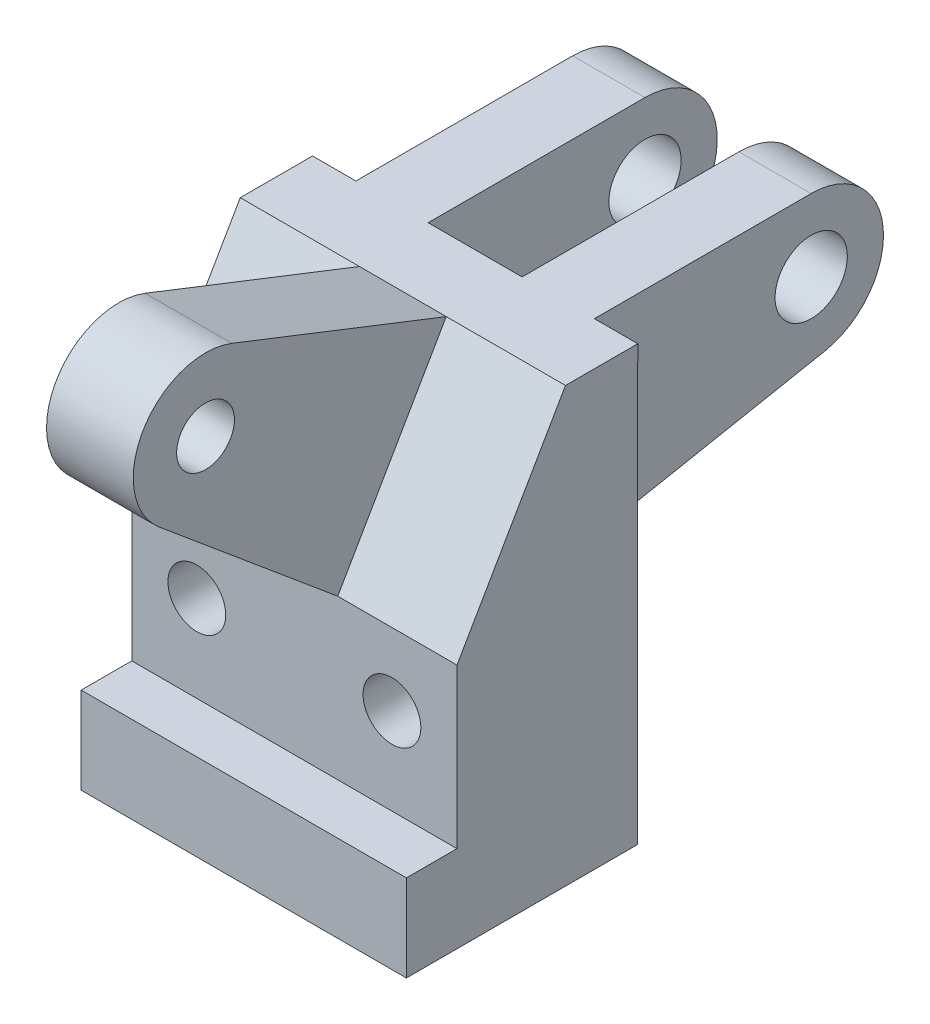
ISO-10303-21;
HEADER;
FILE_DESCRIPTION(('STEP AP214'),'2;1');
FILE_NAME('part.step','',(''),(''),'','','');
FILE_SCHEMA(('AUTOMOTIVE_DESIGN { 1 0 10303 214 1 1 1 1 }'));
ENDSEC;
DATA;
#1=APPLICATION_CONTEXT('core data for automotive mechanical design processes');
#2=APPLICATION_PROTOCOL_DEFINITION('international standard','automotive_design',2000,#1);
#3=PRODUCT_CONTEXT('',#1,'mechanical');
#4=PRODUCT('Part','Part','',(#3));
#5=PRODUCT_RELATED_PRODUCT_CATEGORY('part','',(#4));
#6=PRODUCT_DEFINITION_FORMATION('','',#4);
#7=PRODUCT_DEFINITION_CONTEXT('part definition',#1,'design');
#8=PRODUCT_DEFINITION('design','',#6,#7);
#9=PRODUCT_DEFINITION_SHAPE('','',#8);
#10=(LENGTH_UNIT() NAMED_UNIT(*) SI_UNIT(.MILLI.,.METRE.));
#11=(NAMED_UNIT(*) PLANE_ANGLE_UNIT() SI_UNIT($,.RADIAN.));
#12=(NAMED_UNIT(*) SI_UNIT($,.STERADIAN.) SOLID_ANGLE_UNIT());
#13=UNCERTAINTY_MEASURE_WITH_UNIT(LENGTH_MEASURE(1.E-05),#10,'distance_accuracy_value','');
#14=(GEOMETRIC_REPRESENTATION_CONTEXT(3) GLOBAL_UNCERTAINTY_ASSIGNED_CONTEXT((#13)) GLOBAL_UNIT_ASSIGNED_CONTEXT((#10,
#11,#12)) REPRESENTATION_CONTEXT('',''));
#15=CARTESIAN_POINT('',(0.,0.,0.));
#16=DIRECTION('',(0.,0.,1.));
#17=DIRECTION('',(1.,0.,0.));
#18=AXIS2_PLACEMENT_3D('',#15,#16,#17);
#19=CARTESIAN_POINT('',(22.5,34.0192378864669,9.00000000000001));
#20=DIRECTION('',(0.,-0.500000000000001,-0.866025403784438));
#21=DIRECTION('',(0.,0.866025403784438,-0.500000000000001));
#22=AXIS2_PLACEMENT_3D('',#19,#20,#21);
#23=PLANE('',#22);
#24=DIRECTION('',(0.,0.866025403784438,-0.500000000000001));
#25=VECTOR('',#24,1.);
#26=CARTESIAN_POINT('',(6.,60.0192378864669,-6.01110699893029));
#27=LINE('',#26,#25);
#28=CARTESIAN_POINT('',(6.00000000000001,34.0192378864669,9.00000000000001));
#29=VERTEX_POINT('',#28);
#30=CARTESIAN_POINT('',(6.,60.0192378864669,-6.01110699893029));
#31=VERTEX_POINT('',#30);
#32=EDGE_CURVE('E188',#29,#31,#27,.T.);
#33=ORIENTED_EDGE('',*,*,#32,.F.);
#34=DIRECTION('',(-1.,0.,0.));
#35=VECTOR('',#34,1.);
#36=CARTESIAN_POINT('',(22.5,34.0192378864669,9.00000000000001));
#37=LINE('',#36,#35);
#38=CARTESIAN_POINT('',(22.5,34.0192378864669,9.00000000000001));
#39=VERTEX_POINT('',#38);
#40=EDGE_CURVE('E352',#39,#29,#37,.T.);
#41=ORIENTED_EDGE('',*,*,#40,.F.);
#42=DIRECTION('',(0.,-0.866025403784438,0.500000000000001));
#43=VECTOR('',#42,1.);
#44=CARTESIAN_POINT('',(22.5,34.0192378864669,9.00000000000001));
#45=LINE('',#44,#43);
#46=CARTESIAN_POINT('',(22.5,60.0192378864669,-6.01110699893029));
#47=VERTEX_POINT('',#46);
#48=EDGE_CURVE('E313',#47,#39,#45,.T.);
#49=ORIENTED_EDGE('',*,*,#48,.F.);
#50=DIRECTION('',(-1.,0.,0.));
#51=VECTOR('',#50,1.);
#52=CARTESIAN_POINT('',(22.5,60.0192378864669,-6.01110699893029));
#53=LINE('',#52,#51);
#54=EDGE_CURVE('E357',#47,#31,#53,.T.);
#55=ORIENTED_EDGE('',*,*,#54,.T.);
#56=EDGE_LOOP('',(#33,#41,#49,#55));
#57=FACE_BOUND('',#56,.T.);
#58=ADVANCED_FACE('F38',(#57),#23,.F.);
#59=CARTESIAN_POINT('',(22.5,60.0192378864669,-16.0111069989303));
#60=DIRECTION('',(0.,0.000185116645666411,0.999999982865914));
#61=DIRECTION('',(0.,-0.999999982865914,0.000185116645666411));
#62=AXIS2_PLACEMENT_3D('',#59,#60,#61);
#63=PLANE('',#62);
#64=CARTESIAN_POINT('',(-13.5,24.0192378864669,-16.0044427995721));
#65=DIRECTION('',(0.,0.000185116645666411,0.999999982865914));
#66=DIRECTION('',(0.,-0.999999982865914,0.000185116645666411));
#67=AXIS2_PLACEMENT_3D('',#64,#65,#66);
#68=ELLIPSE('',#67,4.00000006853635,4.);
#69=CARTESIAN_POINT('',(-13.5,20.0192378864669,-16.0037023329768));
#70=VERTEX_POINT('',#69);
#71=EDGE_CURVE('E477',#70,#70,#68,.T.);
#72=ORIENTED_EDGE('',*,*,#71,.T.);
#73=EDGE_LOOP('',(#72));
#74=FACE_BOUND('',#73,.T.);
#75=CARTESIAN_POINT('',(13.5,24.0192378864669,-16.0044427995721));
#76=DIRECTION('',(0.,0.000185116645666411,0.999999982865914));
#77=DIRECTION('',(0.,-0.999999982865914,0.000185116645666411));
#78=AXIS2_PLACEMENT_3D('',#75,#76,#77);
#79=ELLIPSE('',#78,4.00000006853635,4.);
#80=CARTESIAN_POINT('',(13.5,20.0192378864669,-16.0037023329768));
#81=VERTEX_POINT('',#80);
#82=EDGE_CURVE('E484',#81,#81,#79,.T.);
#83=ORIENTED_EDGE('',*,*,#82,.T.);
#84=EDGE_LOOP('',(#83));
#85=FACE_BOUND('',#84,.T.);
#86=DIRECTION('',(0.,-0.999999982865914,0.000185116645666452));
#87=VECTOR('',#86,1.);
#88=CARTESIAN_POINT('',(-16.5,34.0192383319532,-16.006293966143));
#89=LINE('',#88,#87);
#90=CARTESIAN_POINT('',(-16.5,60.0192378864669,-16.0111069989303));
#91=VERTEX_POINT('',#90);
#92=CARTESIAN_POINT('',(-16.5,34.0192383319532,-16.006293966143));
#93=VERTEX_POINT('',#92);
#94=EDGE_CURVE('E215',#91,#93,#89,.T.);
#95=ORIENTED_EDGE('',*,*,#94,.T.);
#96=DIRECTION('',(1.,0.,0.));
#97=VECTOR('',#96,1.);
#98=CARTESIAN_POINT('',(-16.5,34.0192383319532,-16.006293966143));
#99=LINE('',#98,#97);
#100=CARTESIAN_POINT('',(-6.5,34.0192383319532,-16.006293966143));
#101=VERTEX_POINT('',#100);
#102=EDGE_CURVE('E228',#93,#101,#99,.T.);
#103=ORIENTED_EDGE('',*,*,#102,.T.);
#104=DIRECTION('',(0.,-0.999999982865914,0.000185116645666452));
#105=VECTOR('',#104,1.);
#106=CARTESIAN_POINT('',(-6.5,34.0192383319532,-16.006293966143));
#107=LINE('',#106,#105);
#108=CARTESIAN_POINT('',(-6.5,60.0192378864669,-16.0111069989303));
#109=VERTEX_POINT('',#108);
#110=EDGE_CURVE('E231',#109,#101,#107,.T.);
#111=ORIENTED_EDGE('',*,*,#110,.F.);
#112=DIRECTION('',(-1.,0.,0.));
#113=VECTOR('',#112,1.);
#114=CARTESIAN_POINT('',(22.5,60.0192378864669,-16.0111069989303));
#115=LINE('',#114,#113);
#116=CARTESIAN_POINT('',(6.50000000000001,60.0192378864669,-16.0111069989303));
#117=VERTEX_POINT('',#116);
#118=EDGE_CURVE('E364',#117,#109,#115,.T.);
#119=ORIENTED_EDGE('',*,*,#118,.F.);
#120=DIRECTION('',(0.,-0.999999982865914,0.000185116645666452));
#121=VECTOR('',#120,1.);
#122=CARTESIAN_POINT('',(6.5,34.0192383319532,-16.006293966143));
#123=LINE('',#122,#121);
#124=CARTESIAN_POINT('',(6.5,34.0192383319532,-16.006293966143));
#125=VERTEX_POINT('',#124);
#126=EDGE_CURVE('E279',#117,#125,#123,.T.);
#127=ORIENTED_EDGE('',*,*,#126,.T.);
#128=DIRECTION('',(-1.,0.,0.));
#129=VECTOR('',#128,1.);
#130=CARTESIAN_POINT('',(16.5,34.0192383319532,-16.006293966143));
#131=LINE('',#130,#129);
#132=CARTESIAN_POINT('',(16.5,34.0192383319532,-16.006293966143));
#133=VERTEX_POINT('',#132);
#134=EDGE_CURVE('E294',#133,#125,#131,.T.);
#135=ORIENTED_EDGE('',*,*,#134,.F.);
#136=DIRECTION('',(0.,-0.999999982865914,0.000185116645666452));
#137=VECTOR('',#136,1.);
#138=CARTESIAN_POINT('',(16.5,34.0192383319532,-16.006293966143));
#139=LINE('',#138,#137);
#140=CARTESIAN_POINT('',(16.5,60.0192378864669,-16.0111069989303));
#141=VERTEX_POINT('',#140);
#142=EDGE_CURVE('E264',#141,#133,#139,.T.);
#143=ORIENTED_EDGE('',*,*,#142,.F.);
#144=CARTESIAN_POINT('',(22.5,60.0192378864669,-16.0111069989303));
#145=VERTEX_POINT('',#144);
#146=EDGE_CURVE('E361',#145,#141,#115,.T.);
#147=ORIENTED_EDGE('',*,*,#146,.F.);
#148=DIRECTION('',(0.,0.999999982865913,-0.000185116645666411));
#149=VECTOR('',#148,1.);
#150=CARTESIAN_POINT('',(22.5,60.0192378864669,-16.0111069989303));
#151=LINE('',#150,#149);
#152=CARTESIAN_POINT('',(22.5,0.0192378864669156,-16.));
#153=VERTEX_POINT('',#152);
#154=EDGE_CURVE('E307',#153,#145,#151,.T.);
#155=ORIENTED_EDGE('',*,*,#154,.F.);
#156=DIRECTION('',(-1.,0.,0.));
#157=VECTOR('',#156,1.);
#158=CARTESIAN_POINT('',(22.5,0.0192378864669156,-16.));
#159=LINE('',#158,#157);
#160=CARTESIAN_POINT('',(-22.5,0.0192378864669156,-16.));
#161=VERTEX_POINT('',#160);
#162=EDGE_CURVE('E47',#153,#161,#159,.T.);
#163=ORIENTED_EDGE('',*,*,#162,.T.);
#164=DIRECTION('',(0.,0.999999982865913,-0.000185116645666411));
#165=VECTOR('',#164,1.);
#166=CARTESIAN_POINT('',(-22.5,60.0192378864669,-16.0111069989303));
#167=LINE('',#166,#165);
#168=CARTESIAN_POINT('',(-22.5,60.0192378864669,-16.0111069989303));
#169=VERTEX_POINT('',#168);
#170=EDGE_CURVE('E329',#161,#169,#167,.T.);
#171=ORIENTED_EDGE('',*,*,#170,.T.);
#172=EDGE_CURVE('E360',#91,#169,#115,.T.);
#173=ORIENTED_EDGE('',*,*,#172,.F.);
#174=EDGE_LOOP('',(#95,#103,#111,#119,#127,#135,#143,#147,#155,#163,#171,#173));
#175=FACE_BOUND('',#174,.T.);
#176=ADVANCED_FACE('F371',(#74,#85,#175),#63,.F.);
#177=CARTESIAN_POINT('',(22.5,0.019237886466919,16.));
#178=DIRECTION('',(0.,0.,-1.));
#179=DIRECTION('',(0.,1.,0.));
#180=AXIS2_PLACEMENT_3D('',#177,#178,#179);
#181=PLANE('',#180);
#182=DIRECTION('',(0.,-1.,0.));
#183=VECTOR('',#182,1.);
#184=CARTESIAN_POINT('',(-22.5,0.019237886466919,16.));
#185=LINE('',#184,#183);
#186=CARTESIAN_POINT('',(-22.5,12.0192378864669,16.));
#187=VERTEX_POINT('',#186);
#188=CARTESIAN_POINT('',(-22.5,0.019237886466919,16.));
#189=VERTEX_POINT('',#188);
#190=EDGE_CURVE('E298',#187,#189,#185,.T.);
#191=ORIENTED_EDGE('',*,*,#190,.T.);
#192=DIRECTION('',(-1.,0.,0.));
#193=VECTOR('',#192,1.);
#194=CARTESIAN_POINT('',(22.5,0.019237886466919,16.));
#195=LINE('',#194,#193);
#196=CARTESIAN_POINT('',(22.5,0.019237886466919,16.));
#197=VERTEX_POINT('',#196);
#198=EDGE_CURVE('E11',#197,#189,#195,.T.);
#199=ORIENTED_EDGE('',*,*,#198,.F.);
#200=DIRECTION('',(0.,-1.,0.));
#201=VECTOR('',#200,1.);
#202=CARTESIAN_POINT('',(22.5,0.019237886466919,16.));
#203=LINE('',#202,#201);
#204=CARTESIAN_POINT('',(22.5,12.0192378864669,16.));
#205=VERTEX_POINT('',#204);
#206=EDGE_CURVE('E299',#205,#197,#203,.T.);
#207=ORIENTED_EDGE('',*,*,#206,.F.);
#208=DIRECTION('',(-1.,0.,0.));
#209=VECTOR('',#208,1.);
#210=CARTESIAN_POINT('',(22.5,12.0192378864669,16.));
#211=LINE('',#210,#209);
#212=EDGE_CURVE('E322',#205,#187,#211,.T.);
#213=ORIENTED_EDGE('',*,*,#212,.T.);
#214=EDGE_LOOP('',(#191,#199,#207,#213));
#215=FACE_BOUND('',#214,.T.);
#216=ADVANCED_FACE('F40',(#215),#181,.F.);
#217=CARTESIAN_POINT('',(22.5,0.019237886466919,16.));
#218=DIRECTION('',(0.,1.,0.));
#219=DIRECTION('',(0.,0.,1.));
#220=AXIS2_PLACEMENT_3D('',#217,#218,#219);
#221=PLANE('',#220);
#222=DIRECTION('',(0.,0.,-1.));
#223=VECTOR('',#222,1.);
#224=CARTESIAN_POINT('',(-22.5,0.019237886466919,16.));
#225=LINE('',#224,#223);
#226=EDGE_CURVE('E326',#189,#161,#225,.T.);
#227=ORIENTED_EDGE('',*,*,#226,.T.);
#228=ORIENTED_EDGE('',*,*,#162,.F.);
#229=DIRECTION('',(0.,0.,-1.));
#230=VECTOR('',#229,1.);
#231=CARTESIAN_POINT('',(22.5,0.019237886466919,16.));
#232=LINE('',#231,#230);
#233=EDGE_CURVE('E303',#197,#153,#232,.T.);
#234=ORIENTED_EDGE('',*,*,#233,.F.);
#235=ORIENTED_EDGE('',*,*,#198,.T.);
#236=EDGE_LOOP('',(#227,#228,#234,#235));
#237=FACE_BOUND('',#236,.T.);
#238=ADVANCED_FACE('F418',(#237),#221,.F.);
#239=CARTESIAN_POINT('',(22.5,60.0192378864669,-6.01110699893029));
#240=DIRECTION('',(0.,-1.,0.));
#241=DIRECTION('',(0.,0.,-1.));
#242=AXIS2_PLACEMENT_3D('',#239,#240,#241);
#243=PLANE('',#242);
#244=DIRECTION('',(0.,0.,1.));
#245=VECTOR('',#244,1.);
#246=CARTESIAN_POINT('',(-22.5,60.0192378864669,-6.01110699893029));
#247=LINE('',#246,#245);
#248=CARTESIAN_POINT('',(-22.5,60.0192378864669,-6.01110699893029));
#249=VERTEX_POINT('',#248);
#250=EDGE_CURVE('E333',#169,#249,#247,.T.);
#251=ORIENTED_EDGE('',*,*,#250,.T.);
#252=CARTESIAN_POINT('',(-5.99999999999999,60.0192378864669,-6.01110699893029));
#253=VERTEX_POINT('',#252);
#254=EDGE_CURVE('E356',#253,#249,#53,.T.);
#255=ORIENTED_EDGE('',*,*,#254,.F.);
#256=DIRECTION('',(-1.,0.,0.));
#257=VECTOR('',#256,1.);
#258=CARTESIAN_POINT('',(6.,60.0192378864669,-6.01110699893029));
#259=LINE('',#258,#257);
#260=EDGE_CURVE('E451',#31,#253,#259,.T.);
#261=ORIENTED_EDGE('',*,*,#260,.F.);
#262=ORIENTED_EDGE('',*,*,#54,.F.);
#263=DIRECTION('',(0.,0.,1.));
#264=VECTOR('',#263,1.);
#265=CARTESIAN_POINT('',(22.5,60.0192378864669,-6.01110699893029));
#266=LINE('',#265,#264);
#267=EDGE_CURVE('E310',#145,#47,#266,.T.);
#268=ORIENTED_EDGE('',*,*,#267,.F.);
#269=ORIENTED_EDGE('',*,*,#146,.T.);
#270=DIRECTION('',(0.,0.,1.));
#271=VECTOR('',#270,1.);
#272=CARTESIAN_POINT('',(16.5,60.0192378864669,-16.0111069989303));
#273=LINE('',#272,#271);
#274=CARTESIAN_POINT('',(16.5,60.0192378864669,-46.0111069989303));
#275=VERTEX_POINT('',#274);
#276=EDGE_CURVE('E260',#275,#141,#273,.T.);
#277=ORIENTED_EDGE('',*,*,#276,.F.);
#278=DIRECTION('',(-1.,0.,0.));
#279=VECTOR('',#278,1.);
#280=CARTESIAN_POINT('',(16.5,60.0192378864669,-46.0111069989303));
#281=LINE('',#280,#279);
#282=CARTESIAN_POINT('',(6.5,60.0192378864669,-46.0111069989303));
#283=VERTEX_POINT('',#282);
#284=EDGE_CURVE('E275',#275,#283,#281,.T.);
#285=ORIENTED_EDGE('',*,*,#284,.T.);
#286=DIRECTION('',(0.,0.,1.));
#287=VECTOR('',#286,1.);
#288=CARTESIAN_POINT('',(6.5,60.0192378864669,-16.0111069989303));
#289=LINE('',#288,#287);
#290=EDGE_CURVE('E256',#283,#117,#289,.T.);
#291=ORIENTED_EDGE('',*,*,#290,.T.);
#292=ORIENTED_EDGE('',*,*,#118,.T.);
#293=DIRECTION('',(0.,0.,1.));
#294=VECTOR('',#293,1.);
#295=CARTESIAN_POINT('',(-6.5,60.0192378864669,-16.0111069989303));
#296=LINE('',#295,#294);
#297=CARTESIAN_POINT('',(-6.5,60.0192378864669,-46.0111069989303));
#298=VERTEX_POINT('',#297);
#299=EDGE_CURVE('E210',#298,#109,#296,.T.);
#300=ORIENTED_EDGE('',*,*,#299,.F.);
#301=DIRECTION('',(1.,0.,0.));
#302=VECTOR('',#301,1.);
#303=CARTESIAN_POINT('',(-16.5,60.0192378864669,-46.0111069989303));
#304=LINE('',#303,#302);
#305=CARTESIAN_POINT('',(-16.5,60.0192378864669,-46.0111069989303));
#306=VERTEX_POINT('',#305);
#307=EDGE_CURVE('E242',#306,#298,#304,.T.);
#308=ORIENTED_EDGE('',*,*,#307,.F.);
#309=DIRECTION('',(0.,0.,1.));
#310=VECTOR('',#309,1.);
#311=CARTESIAN_POINT('',(-16.5,60.0192378864669,-16.0111069989303));
#312=LINE('',#311,#310);
#313=EDGE_CURVE('E212',#306,#91,#312,.T.);
#314=ORIENTED_EDGE('',*,*,#313,.T.);
#315=ORIENTED_EDGE('',*,*,#172,.T.);
#316=EDGE_LOOP('',(#251,#255,#261,#262,#268,#269,#277,#285,#291,#292,#300,#308,#314,#315));
#317=FACE_BOUND('',#316,.T.);
#318=ADVANCED_FACE('F382',(#317),#243,.F.);
#319=CARTESIAN_POINT('',(-5.99999999999999,34.0192378864669,9.00000000000001));
#320=VERTEX_POINT('',#319);
#321=CARTESIAN_POINT('',(-22.5,34.0192378864669,9.00000000000001));
#322=VERTEX_POINT('',#321);
#323=EDGE_CURVE('E59',#320,#322,#37,.T.);
#324=ORIENTED_EDGE('',*,*,#323,.F.);
#325=DIRECTION('',(0.,0.866025403784438,-0.500000000000001));
#326=VECTOR('',#325,1.);
#327=CARTESIAN_POINT('',(-6.,60.0192378864669,-6.01110699893029));
#328=LINE('',#327,#326);
#329=EDGE_CURVE('E54',#320,#253,#328,.T.);
#330=ORIENTED_EDGE('',*,*,#329,.T.);
#331=ORIENTED_EDGE('',*,*,#254,.T.);
#332=DIRECTION('',(0.,-0.866025403784438,0.500000000000001));
#333=VECTOR('',#332,1.);
#334=CARTESIAN_POINT('',(-22.5,34.0192378864669,9.00000000000001));
#335=LINE('',#334,#333);
#336=EDGE_CURVE('E337',#249,#322,#335,.T.);
#337=ORIENTED_EDGE('',*,*,#336,.T.);
#338=EDGE_LOOP('',(#324,#330,#331,#337));
#339=FACE_BOUND('',#338,.T.);
#340=ADVANCED_FACE('F432',(#339),#23,.F.);
#341=CARTESIAN_POINT('',(22.5,12.0192378864669,9.00000000000001));
#342=DIRECTION('',(0.,0.,-1.));
#343=DIRECTION('',(-1.,0.,0.));
#344=AXIS2_PLACEMENT_3D('',#341,#342,#343);
#345=PLANE('',#344);
#346=CARTESIAN_POINT('',(-13.5,24.0192378864669,9.00000000000001));
#347=DIRECTION('',(0.,0.,1.));
#348=DIRECTION('',(1.,0.,0.));
#349=AXIS2_PLACEMENT_3D('',#346,#347,#348);
#350=CIRCLE('',#349,4.);
#351=CARTESIAN_POINT('',(-9.5,24.0192378864669,9.00000000000001));
#352=VERTEX_POINT('',#351);
#353=EDGE_CURVE('E488',#352,#352,#350,.T.);
#354=ORIENTED_EDGE('',*,*,#353,.F.);
#355=EDGE_LOOP('',(#354));
#356=FACE_BOUND('',#355,.T.);
#357=CARTESIAN_POINT('',(13.5,24.0192378864669,9.00000000000001));
#358=DIRECTION('',(0.,0.,1.));
#359=DIRECTION('',(1.,0.,0.));
#360=AXIS2_PLACEMENT_3D('',#357,#358,#359);
#361=CIRCLE('',#360,4.);
#362=CARTESIAN_POINT('',(17.5,24.0192378864669,9.00000000000001));
#363=VERTEX_POINT('',#362);
#364=EDGE_CURVE('E489',#363,#363,#361,.T.);
#365=ORIENTED_EDGE('',*,*,#364,.F.);
#366=EDGE_LOOP('',(#365));
#367=FACE_BOUND('',#366,.T.);
#368=DIRECTION('',(0.,-1.,0.));
#369=VECTOR('',#368,1.);
#370=CARTESIAN_POINT('',(-22.5,12.0192378864669,9.00000000000001));
#371=LINE('',#370,#369);
#372=CARTESIAN_POINT('',(-22.5,12.0192378864669,9.00000000000001));
#373=VERTEX_POINT('',#372);
#374=EDGE_CURVE('E340',#322,#373,#371,.T.);
#375=ORIENTED_EDGE('',*,*,#374,.T.);
#376=DIRECTION('',(-1.,0.,0.));
#377=VECTOR('',#376,1.);
#378=CARTESIAN_POINT('',(22.5,12.0192378864669,9.00000000000001));
#379=LINE('',#378,#377);
#380=CARTESIAN_POINT('',(22.5,12.0192378864669,9.00000000000001));
#381=VERTEX_POINT('',#380);
#382=EDGE_CURVE('E348',#381,#373,#379,.T.);
#383=ORIENTED_EDGE('',*,*,#382,.F.);
#384=DIRECTION('',(0.,-1.,0.));
#385=VECTOR('',#384,1.);
#386=CARTESIAN_POINT('',(22.5,12.0192378864669,9.00000000000001));
#387=LINE('',#386,#385);
#388=EDGE_CURVE('E316',#39,#381,#387,.T.);
#389=ORIENTED_EDGE('',*,*,#388,.F.);
#390=ORIENTED_EDGE('',*,*,#40,.T.);
#391=DIRECTION('',(-1.,0.,0.));
#392=VECTOR('',#391,1.);
#393=CARTESIAN_POINT('',(6.,34.0192378864669,9.00000000000001));
#394=LINE('',#393,#392);
#395=EDGE_CURVE('E204',#29,#320,#394,.T.);
#396=ORIENTED_EDGE('',*,*,#395,.T.);
#397=ORIENTED_EDGE('',*,*,#323,.T.);
#398=EDGE_LOOP('',(#375,#383,#389,#390,#396,#397));
#399=FACE_BOUND('',#398,.T.);
#400=ADVANCED_FACE('F428',(#356,#367,#399),#345,.F.);
#401=CARTESIAN_POINT('',(22.5,12.0192378864669,16.));
#402=DIRECTION('',(0.,-1.,0.));
#403=DIRECTION('',(0.,0.,-1.));
#404=AXIS2_PLACEMENT_3D('',#401,#402,#403);
#405=PLANE('',#404);
#406=DIRECTION('',(0.,0.,1.));
#407=VECTOR('',#406,1.);
#408=CARTESIAN_POINT('',(-22.5,12.0192378864669,16.));
#409=LINE('',#408,#407);
#410=EDGE_CURVE('E304',#373,#187,#409,.T.);
#411=ORIENTED_EDGE('',*,*,#410,.T.);
#412=ORIENTED_EDGE('',*,*,#212,.F.);
#413=DIRECTION('',(0.,0.,1.));
#414=VECTOR('',#413,1.);
#415=CARTESIAN_POINT('',(22.5,12.0192378864669,16.));
#416=LINE('',#415,#414);
#417=EDGE_CURVE('E319',#381,#205,#416,.T.);
#418=ORIENTED_EDGE('',*,*,#417,.F.);
#419=ORIENTED_EDGE('',*,*,#382,.T.);
#420=EDGE_LOOP('',(#411,#412,#418,#419));
#421=FACE_BOUND('',#420,.T.);
#422=ADVANCED_FACE('F423',(#421),#405,.F.);
#423=CARTESIAN_POINT('',(22.5,0.,0.));
#424=DIRECTION('',(-1.,0.,0.));
#425=DIRECTION('',(0.,0.,1.));
#426=AXIS2_PLACEMENT_3D('',#423,#424,#425);
#427=PLANE('',#426);
#428=ORIENTED_EDGE('',*,*,#206,.T.);
#429=ORIENTED_EDGE('',*,*,#233,.T.);
#430=ORIENTED_EDGE('',*,*,#154,.T.);
#431=ORIENTED_EDGE('',*,*,#267,.T.);
#432=ORIENTED_EDGE('',*,*,#48,.T.);
#433=ORIENTED_EDGE('',*,*,#388,.T.);
#434=ORIENTED_EDGE('',*,*,#417,.T.);
#435=EDGE_LOOP('',(#428,#429,#430,#431,#432,#433,#434));
#436=FACE_BOUND('',#435,.T.);
#437=ADVANCED_FACE('F414',(#436),#427,.F.);
#438=CARTESIAN_POINT('',(-22.5,0.,0.));
#439=DIRECTION('',(-1.,0.,0.));
#440=DIRECTION('',(0.,0.,1.));
#441=AXIS2_PLACEMENT_3D('',#438,#439,#440);
#442=PLANE('',#441);
#443=ORIENTED_EDGE('',*,*,#190,.F.);
#444=ORIENTED_EDGE('',*,*,#410,.F.);
#445=ORIENTED_EDGE('',*,*,#374,.F.);
#446=ORIENTED_EDGE('',*,*,#336,.F.);
#447=ORIENTED_EDGE('',*,*,#250,.F.);
#448=ORIENTED_EDGE('',*,*,#170,.F.);
#449=ORIENTED_EDGE('',*,*,#226,.F.);
#450=EDGE_LOOP('',(#443,#444,#445,#446,#447,#448,#449));
#451=FACE_BOUND('',#450,.T.);
#452=ADVANCED_FACE('F378',(#451),#442,.T.);
#453=CARTESIAN_POINT('',(16.5,50.0192378864669,-46.0111069989303));
#454=DIRECTION('',(1.,0.,0.));
#455=DIRECTION('',(0.,0.,-1.));
#456=AXIS2_PLACEMENT_3D('',#453,#454,#455);
#457=PLANE('',#456);
#458=ORIENTED_EDGE('',*,*,#276,.T.);
#459=ORIENTED_EDGE('',*,*,#142,.T.);
#460=DIRECTION('',(0.,0.190230507607556,-0.981739453203023));
#461=VECTOR('',#460,1.);
#462=CARTESIAN_POINT('',(16.5,40.2018433544367,-47.9134120750059));
#463=LINE('',#462,#461);
#464=CARTESIAN_POINT('',(16.5,40.2018433544367,-47.9134120750059));
#465=VERTEX_POINT('',#464);
#466=EDGE_CURVE('E269',#133,#465,#463,.T.);
#467=ORIENTED_EDGE('',*,*,#466,.T.);
#468=CARTESIAN_POINT('',(16.5,50.0192378864669,-46.0111069989303));
#469=DIRECTION('',(1.,0.,0.));
#470=DIRECTION('',(0.,0.,-1.));
#471=AXIS2_PLACEMENT_3D('',#468,#469,#470);
#472=CIRCLE('',#471,10.);
#473=EDGE_CURVE('E272',#465,#275,#472,.T.);
#474=ORIENTED_EDGE('',*,*,#473,.T.);
#475=EDGE_LOOP('',(#458,#459,#467,#474));
#476=FACE_BOUND('',#475,.T.);
#477=CARTESIAN_POINT('',(16.5,50.0192378864669,-46.0111069989303));
#478=DIRECTION('',(1.,0.,0.));
#479=DIRECTION('',(0.,0.,-1.));
#480=AXIS2_PLACEMENT_3D('',#477,#478,#479);
#481=CIRCLE('',#480,5.);
#482=CARTESIAN_POINT('',(16.5,50.0192378864669,-51.0111069989303));
#483=VERTEX_POINT('',#482);
#484=EDGE_CURVE('E252',#483,#483,#481,.T.);
#485=ORIENTED_EDGE('',*,*,#484,.F.);
#486=EDGE_LOOP('',(#485));
#487=FACE_BOUND('',#486,.T.);
#488=ADVANCED_FACE('F408',(#476,#487),#457,.T.);
#489=CARTESIAN_POINT('',(6.5,50.0192378864669,-46.0111069989303));
#490=DIRECTION('',(1.,0.,0.));
#491=DIRECTION('',(0.,0.,-1.));
#492=AXIS2_PLACEMENT_3D('',#489,#490,#491);
#493=PLANE('',#492);
#494=ORIENTED_EDGE('',*,*,#290,.F.);
#495=CARTESIAN_POINT('',(6.5,50.0192378864669,-46.0111069989303));
#496=DIRECTION('',(1.,0.,0.));
#497=DIRECTION('',(0.,0.,-1.));
#498=AXIS2_PLACEMENT_3D('',#495,#496,#497);
#499=CIRCLE('',#498,10.);
#500=CARTESIAN_POINT('',(6.5,40.2018433544367,-47.9134120750059));
#501=VERTEX_POINT('',#500);
#502=EDGE_CURVE('E265',#501,#283,#499,.T.);
#503=ORIENTED_EDGE('',*,*,#502,.F.);
#504=DIRECTION('',(0.,0.190230507607556,-0.981739453203023));
#505=VECTOR('',#504,1.);
#506=CARTESIAN_POINT('',(6.5,40.2018433544367,-47.9134120750059));
#507=LINE('',#506,#505);
#508=EDGE_CURVE('E282',#125,#501,#507,.T.);
#509=ORIENTED_EDGE('',*,*,#508,.F.);
#510=ORIENTED_EDGE('',*,*,#126,.F.);
#511=EDGE_LOOP('',(#494,#503,#509,#510));
#512=FACE_BOUND('',#511,.T.);
#513=CARTESIAN_POINT('',(6.5,50.0192378864669,-46.0111069989303));
#514=DIRECTION('',(1.,0.,0.));
#515=DIRECTION('',(0.,0.,-1.));
#516=AXIS2_PLACEMENT_3D('',#513,#514,#515);
#517=CIRCLE('',#516,5.);
#518=CARTESIAN_POINT('',(6.5,50.0192378864669,-51.0111069989303));
#519=VERTEX_POINT('',#518);
#520=EDGE_CURVE('E245',#519,#519,#517,.T.);
#521=ORIENTED_EDGE('',*,*,#520,.T.);
#522=EDGE_LOOP('',(#521));
#523=FACE_BOUND('',#522,.T.);
#524=ADVANCED_FACE('F395',(#512,#523),#493,.F.);
#525=CARTESIAN_POINT('',(16.5,40.2018433544367,-47.9134120750059));
#526=DIRECTION('',(0.,0.981739453203023,0.190230507607556));
#527=DIRECTION('',(0.,-0.190230507607556,0.981739453203024));
#528=AXIS2_PLACEMENT_3D('',#525,#526,#527);
#529=PLANE('',#528);
#530=ORIENTED_EDGE('',*,*,#508,.T.);
#531=DIRECTION('',(-1.,0.,0.));
#532=VECTOR('',#531,1.);
#533=CARTESIAN_POINT('',(16.5,40.2018433544367,-47.9134120750059));
#534=LINE('',#533,#532);
#535=EDGE_CURVE('E290',#465,#501,#534,.T.);
#536=ORIENTED_EDGE('',*,*,#535,.F.);
#537=ORIENTED_EDGE('',*,*,#466,.F.);
#538=ORIENTED_EDGE('',*,*,#134,.T.);
#539=EDGE_LOOP('',(#530,#536,#537,#538));
#540=FACE_BOUND('',#539,.T.);
#541=ADVANCED_FACE('F400',(#540),#529,.F.);
#542=CARTESIAN_POINT('',(16.5,50.0192378864669,-46.0111069989303));
#543=DIRECTION('',(-1.,0.,0.));
#544=DIRECTION('',(0.,0.,1.));
#545=AXIS2_PLACEMENT_3D('',#542,#543,#544);
#546=CYLINDRICAL_SURFACE('',#545,10.);
#547=ORIENTED_EDGE('',*,*,#502,.T.);
#548=ORIENTED_EDGE('',*,*,#284,.F.);
#549=ORIENTED_EDGE('',*,*,#473,.F.);
#550=ORIENTED_EDGE('',*,*,#535,.T.);
#551=EDGE_LOOP('',(#547,#548,#549,#550));
#552=FACE_BOUND('',#551,.T.);
#553=ADVANCED_FACE('F404',(#552),#546,.T.);
#554=CARTESIAN_POINT('',(16.5,50.0192378864669,-46.0111069989303));
#555=DIRECTION('',(-1.,0.,0.));
#556=DIRECTION('',(0.,0.,1.));
#557=AXIS2_PLACEMENT_3D('',#554,#555,#556);
#558=CYLINDRICAL_SURFACE('',#557,5.);
#559=ORIENTED_EDGE('',*,*,#484,.T.);
#560=EDGE_LOOP('',(#559));
#561=FACE_BOUND('',#560,.T.);
#562=ORIENTED_EDGE('',*,*,#520,.F.);
#563=EDGE_LOOP('',(#562));
#564=FACE_BOUND('',#563,.T.);
#565=ADVANCED_FACE('F545',(#561,#564),#558,.F.);
#566=CARTESIAN_POINT('',(-16.5,50.0192378864669,-46.0111069989303));
#567=DIRECTION('',(1.,0.,0.));
#568=DIRECTION('',(0.,0.,-1.));
#569=AXIS2_PLACEMENT_3D('',#566,#567,#568);
#570=CYLINDRICAL_SURFACE('',#569,10.);
#571=CARTESIAN_POINT('',(-6.5,50.0192378864669,-46.0111069989303));
#572=DIRECTION('',(1.,0.,0.));
#573=DIRECTION('',(0.,0.,-1.));
#574=AXIS2_PLACEMENT_3D('',#571,#572,#573);
#575=CIRCLE('',#574,10.);
#576=CARTESIAN_POINT('',(-6.5,40.2018433544367,-47.9134120750059));
#577=VERTEX_POINT('',#576);
#578=EDGE_CURVE('E216',#577,#298,#575,.T.);
#579=ORIENTED_EDGE('',*,*,#578,.F.);
#580=DIRECTION('',(1.,0.,0.));
#581=VECTOR('',#580,1.);
#582=CARTESIAN_POINT('',(-16.5,40.2018433544367,-47.9134120750059));
#583=LINE('',#582,#581);
#584=CARTESIAN_POINT('',(-16.5,40.2018433544367,-47.9134120750059));
#585=VERTEX_POINT('',#584);
#586=EDGE_CURVE('E246',#585,#577,#583,.T.);
#587=ORIENTED_EDGE('',*,*,#586,.F.);
#588=CARTESIAN_POINT('',(-16.5,50.0192378864669,-46.0111069989303));
#589=DIRECTION('',(1.,0.,0.));
#590=DIRECTION('',(0.,0.,-1.));
#591=AXIS2_PLACEMENT_3D('',#588,#589,#590);
#592=CIRCLE('',#591,10.);
#593=EDGE_CURVE('E224',#585,#306,#592,.T.);
#594=ORIENTED_EDGE('',*,*,#593,.T.);
#595=ORIENTED_EDGE('',*,*,#307,.T.);
#596=EDGE_LOOP('',(#579,#587,#594,#595));
#597=FACE_BOUND('',#596,.T.);
#598=ADVANCED_FACE('F542',(#597),#570,.T.);
#599=CARTESIAN_POINT('',(-16.5,40.2018433544367,-47.9134120750059));
#600=DIRECTION('',(0.,-0.981739453203023,-0.190230507607556));
#601=DIRECTION('',(0.,0.190230507607556,-0.981739453203024));
#602=AXIS2_PLACEMENT_3D('',#599,#600,#601);
#603=PLANE('',#602);
#604=DIRECTION('',(0.,0.190230507607556,-0.981739453203023));
#605=VECTOR('',#604,1.);
#606=CARTESIAN_POINT('',(-6.5,40.2018433544367,-47.9134120750059));
#607=LINE('',#606,#605);
#608=EDGE_CURVE('E235',#101,#577,#607,.T.);
#609=ORIENTED_EDGE('',*,*,#608,.F.);
#610=ORIENTED_EDGE('',*,*,#102,.F.);
#611=DIRECTION('',(0.,0.190230507607556,-0.981739453203023));
#612=VECTOR('',#611,1.);
#613=CARTESIAN_POINT('',(-16.5,40.2018433544367,-47.9134120750059));
#614=LINE('',#613,#612);
#615=EDGE_CURVE('E220',#93,#585,#614,.T.);
#616=ORIENTED_EDGE('',*,*,#615,.T.);
#617=ORIENTED_EDGE('',*,*,#586,.T.);
#618=EDGE_LOOP('',(#609,#610,#616,#617));
#619=FACE_BOUND('',#618,.T.);
#620=ADVANCED_FACE('F537',(#619),#603,.T.);
#621=CARTESIAN_POINT('',(-16.5,50.0192378864669,-46.0111069989303));
#622=DIRECTION('',(1.,0.,0.));
#623=DIRECTION('',(0.,0.,-1.));
#624=AXIS2_PLACEMENT_3D('',#621,#622,#623);
#625=PLANE('',#624);
#626=CARTESIAN_POINT('',(-16.5,50.0192378864669,-46.0111069989303));
#627=DIRECTION('',(1.,0.,0.));
#628=DIRECTION('',(0.,0.,-1.));
#629=AXIS2_PLACEMENT_3D('',#626,#627,#628);
#630=CIRCLE('',#629,5.);
#631=CARTESIAN_POINT('',(-16.5,50.0192378864669,-51.0111069989303));
#632=VERTEX_POINT('',#631);
#633=EDGE_CURVE('E202',#632,#632,#630,.T.);
#634=ORIENTED_EDGE('',*,*,#633,.T.);
#635=EDGE_LOOP('',(#634));
#636=FACE_BOUND('',#635,.T.);
#637=ORIENTED_EDGE('',*,*,#313,.F.);
#638=ORIENTED_EDGE('',*,*,#593,.F.);
#639=ORIENTED_EDGE('',*,*,#615,.F.);
#640=ORIENTED_EDGE('',*,*,#94,.F.);
#641=EDGE_LOOP('',(#637,#638,#639,#640));
#642=FACE_BOUND('',#641,.T.);
#643=ADVANCED_FACE('F534',(#636,#642),#625,.F.);
#644=CARTESIAN_POINT('',(-6.5,50.0192378864669,-46.0111069989303));
#645=DIRECTION('',(1.,0.,0.));
#646=DIRECTION('',(0.,0.,-1.));
#647=AXIS2_PLACEMENT_3D('',#644,#645,#646);
#648=PLANE('',#647);
#649=CARTESIAN_POINT('',(-6.5,50.0192378864669,-46.0111069989303));
#650=DIRECTION('',(1.,0.,0.));
#651=DIRECTION('',(0.,0.,-1.));
#652=AXIS2_PLACEMENT_3D('',#649,#650,#651);
#653=CIRCLE('',#652,5.);
#654=CARTESIAN_POINT('',(-6.5,50.0192378864669,-51.0111069989303));
#655=VERTEX_POINT('',#654);
#656=EDGE_CURVE('E197',#655,#655,#653,.T.);
#657=ORIENTED_EDGE('',*,*,#656,.F.);
#658=EDGE_LOOP('',(#657));
#659=FACE_BOUND('',#658,.T.);
#660=ORIENTED_EDGE('',*,*,#299,.T.);
#661=ORIENTED_EDGE('',*,*,#110,.T.);
#662=ORIENTED_EDGE('',*,*,#608,.T.);
#663=ORIENTED_EDGE('',*,*,#578,.T.);
#664=EDGE_LOOP('',(#660,#661,#662,#663));
#665=FACE_BOUND('',#664,.T.);
#666=ADVANCED_FACE('F532',(#659,#665),#648,.T.);
#667=CARTESIAN_POINT('',(-16.5,50.0192378864669,-46.0111069989303));
#668=DIRECTION('',(1.,0.,0.));
#669=DIRECTION('',(0.,0.,-1.));
#670=AXIS2_PLACEMENT_3D('',#667,#668,#669);
#671=CYLINDRICAL_SURFACE('',#670,5.);
#672=ORIENTED_EDGE('',*,*,#633,.F.);
#673=EDGE_LOOP('',(#672));
#674=FACE_BOUND('',#673,.T.);
#675=ORIENTED_EDGE('',*,*,#656,.T.);
#676=EDGE_LOOP('',(#675));
#677=FACE_BOUND('',#676,.T.);
#678=ADVANCED_FACE('F520',(#674,#677),#671,.F.);
#679=CARTESIAN_POINT('',(6.,62.3341248717539,27.2934085283483));
#680=DIRECTION('',(1.,0.,0.));
#681=DIRECTION('',(0.,0.,-1.));
#682=AXIS2_PLACEMENT_3D('',#679,#680,#681);
#683=PLANE('',#682);
#684=DIRECTION('',(0.,0.364971618776445,0.931018645080592));
#685=VECTOR('',#684,1.);
#686=CARTESIAN_POINT('',(6.,60.0192378864669,-6.01110699893029));
#687=LINE('',#686,#685);
#688=CARTESIAN_POINT('',(6.,71.6443113225598,23.6436923405839));
#689=VERTEX_POINT('',#688);
#690=EDGE_CURVE('E182',#31,#689,#687,.T.);
#691=ORIENTED_EDGE('',*,*,#690,.T.);
#692=CARTESIAN_POINT('',(6.,62.3341248717539,27.2934085283483));
#693=DIRECTION('',(1.,0.,0.));
#694=DIRECTION('',(0.,0.,-1.));
#695=AXIS2_PLACEMENT_3D('',#692,#693,#694);
#696=CIRCLE('',#695,10.);
#697=CARTESIAN_POINT('',(6.,54.6600619740631,33.7050197644024));
#698=VERTEX_POINT('',#697);
#699=EDGE_CURVE('E169',#689,#698,#696,.T.);
#700=ORIENTED_EDGE('',*,*,#699,.T.);
#701=DIRECTION('',(0.,-0.641161123605388,-0.767406289769035));
#702=VECTOR('',#701,1.);
#703=CARTESIAN_POINT('',(6.,34.0192378864669,9.00000000000001));
#704=LINE('',#703,#702);
#705=EDGE_CURVE('E181',#698,#29,#704,.T.);
#706=ORIENTED_EDGE('',*,*,#705,.T.);
#707=ORIENTED_EDGE('',*,*,#32,.T.);
#708=EDGE_LOOP('',(#691,#700,#706,#707));
#709=FACE_BOUND('',#708,.T.);
#710=CARTESIAN_POINT('',(6.,62.3341248717539,27.2934085283483));
#711=DIRECTION('',(1.,0.,0.));
#712=DIRECTION('',(0.,0.,-1.));
#713=AXIS2_PLACEMENT_3D('',#710,#711,#712);
#714=CIRCLE('',#713,4.);
#715=CARTESIAN_POINT('',(6.,62.3341248717539,23.2934085283483));
#716=VERTEX_POINT('',#715);
#717=EDGE_CURVE('E471',#716,#716,#714,.T.);
#718=ORIENTED_EDGE('',*,*,#717,.F.);
#719=EDGE_LOOP('',(#718));
#720=FACE_BOUND('',#719,.T.);
#721=ADVANCED_FACE('F186',(#709,#720),#683,.T.);
#722=CARTESIAN_POINT('',(-6.,62.3341248717539,27.2934085283483));
#723=DIRECTION('',(1.,0.,0.));
#724=DIRECTION('',(0.,0.,-1.));
#725=AXIS2_PLACEMENT_3D('',#722,#723,#724);
#726=PLANE('',#725);
#727=DIRECTION('',(0.,0.364971618776445,0.931018645080592));
#728=VECTOR('',#727,1.);
#729=CARTESIAN_POINT('',(-6.,60.0192378864669,-6.01110699893029));
#730=LINE('',#729,#728);
#731=CARTESIAN_POINT('',(-6.,71.6443113225598,23.6436923405839));
#732=VERTEX_POINT('',#731);
#733=EDGE_CURVE('E195',#253,#732,#730,.T.);
#734=ORIENTED_EDGE('',*,*,#733,.F.);
#735=ORIENTED_EDGE('',*,*,#329,.F.);
#736=DIRECTION('',(0.,-0.641161123605388,-0.767406289769035));
#737=VECTOR('',#736,1.);
#738=CARTESIAN_POINT('',(-6.,34.0192378864669,9.00000000000001));
#739=LINE('',#738,#737);
#740=CARTESIAN_POINT('',(-6.,54.6600619740631,33.7050197644024));
#741=VERTEX_POINT('',#740);
#742=EDGE_CURVE('E458',#741,#320,#739,.T.);
#743=ORIENTED_EDGE('',*,*,#742,.F.);
#744=CARTESIAN_POINT('',(-6.,62.3341248717539,27.2934085283483));
#745=DIRECTION('',(1.,0.,0.));
#746=DIRECTION('',(0.,0.,-1.));
#747=AXIS2_PLACEMENT_3D('',#744,#745,#746);
#748=CIRCLE('',#747,10.);
#749=EDGE_CURVE('E467',#732,#741,#748,.T.);
#750=ORIENTED_EDGE('',*,*,#749,.F.);
#751=EDGE_LOOP('',(#734,#735,#743,#750));
#752=FACE_BOUND('',#751,.T.);
#753=CARTESIAN_POINT('',(-6.,62.3341248717539,27.2934085283483));
#754=DIRECTION('',(1.,0.,0.));
#755=DIRECTION('',(0.,0.,-1.));
#756=AXIS2_PLACEMENT_3D('',#753,#754,#755);
#757=CIRCLE('',#756,4.);
#758=CARTESIAN_POINT('',(-6.,62.3341248717539,23.2934085283483));
#759=VERTEX_POINT('',#758);
#760=EDGE_CURVE('E473',#759,#759,#757,.T.);
#761=ORIENTED_EDGE('',*,*,#760,.T.);
#762=EDGE_LOOP('',(#761));
#763=FACE_BOUND('',#762,.T.);
#764=ADVANCED_FACE('F519',(#752,#763),#726,.F.);
#765=CARTESIAN_POINT('',(6.,60.0192378864669,-6.01110699893029));
#766=DIRECTION('',(0.,-0.931018645080592,0.364971618776445));
#767=DIRECTION('',(0.,-0.364971618776445,-0.931018645080592));
#768=AXIS2_PLACEMENT_3D('',#765,#766,#767);
#769=PLANE('',#768);
#770=ORIENTED_EDGE('',*,*,#733,.T.);
#771=DIRECTION('',(-1.,0.,0.));
#772=VECTOR('',#771,1.);
#773=CARTESIAN_POINT('',(6.,71.6443113225598,23.6436923405839));
#774=LINE('',#773,#772);
#775=EDGE_CURVE('E173',#689,#732,#774,.T.);
#776=ORIENTED_EDGE('',*,*,#775,.F.);
#777=ORIENTED_EDGE('',*,*,#690,.F.);
#778=ORIENTED_EDGE('',*,*,#260,.T.);
#779=EDGE_LOOP('',(#770,#776,#777,#778));
#780=FACE_BOUND('',#779,.T.);
#781=ADVANCED_FACE('F193',(#780),#769,.F.);
#782=CARTESIAN_POINT('',(6.,62.3341248717539,27.2934085283483));
#783=DIRECTION('',(-1.,0.,0.));
#784=DIRECTION('',(0.,0.,1.));
#785=AXIS2_PLACEMENT_3D('',#782,#783,#784);
#786=CYLINDRICAL_SURFACE('',#785,10.);
#787=ORIENTED_EDGE('',*,*,#749,.T.);
#788=DIRECTION('',(-1.,0.,0.));
#789=VECTOR('',#788,1.);
#790=CARTESIAN_POINT('',(6.,54.6600619740631,33.7050197644024));
#791=LINE('',#790,#789);
#792=EDGE_CURVE('E176',#698,#741,#791,.T.);
#793=ORIENTED_EDGE('',*,*,#792,.F.);
#794=ORIENTED_EDGE('',*,*,#699,.F.);
#795=ORIENTED_EDGE('',*,*,#775,.T.);
#796=EDGE_LOOP('',(#787,#793,#794,#795));
#797=FACE_BOUND('',#796,.T.);
#798=ADVANCED_FACE('F171',(#797),#786,.T.);
#799=CARTESIAN_POINT('',(6.,34.0192378864669,9.00000000000001));
#800=DIRECTION('',(0.,0.767406289769035,-0.641161123605388));
#801=DIRECTION('',(0.,0.641161123605388,0.767406289769035));
#802=AXIS2_PLACEMENT_3D('',#799,#800,#801);
#803=PLANE('',#802);
#804=ORIENTED_EDGE('',*,*,#742,.T.);
#805=ORIENTED_EDGE('',*,*,#395,.F.);
#806=ORIENTED_EDGE('',*,*,#705,.F.);
#807=ORIENTED_EDGE('',*,*,#792,.T.);
#808=EDGE_LOOP('',(#804,#805,#806,#807));
#809=FACE_BOUND('',#808,.T.);
#810=ADVANCED_FACE('F456',(#809),#803,.F.);
#811=CARTESIAN_POINT('',(6.,62.3341248717539,27.2934085283483));
#812=DIRECTION('',(-1.,0.,0.));
#813=DIRECTION('',(0.,0.,1.));
#814=AXIS2_PLACEMENT_3D('',#811,#812,#813);
#815=CYLINDRICAL_SURFACE('',#814,4.);
#816=ORIENTED_EDGE('',*,*,#717,.T.);
#817=EDGE_LOOP('',(#816));
#818=FACE_BOUND('',#817,.T.);
#819=ORIENTED_EDGE('',*,*,#760,.F.);
#820=EDGE_LOOP('',(#819));
#821=FACE_BOUND('',#820,.T.);
#822=ADVANCED_FACE('F505',(#818,#821),#815,.F.);
#823=CARTESIAN_POINT('',(13.5,24.0192378864669,-56.0111069989303));
#824=DIRECTION('',(0.,0.,1.));
#825=DIRECTION('',(1.,0.,0.));
#826=AXIS2_PLACEMENT_3D('',#823,#824,#825);
#827=CYLINDRICAL_SURFACE('',#826,4.);
#828=ORIENTED_EDGE('',*,*,#364,.T.);
#829=EDGE_LOOP('',(#828));
#830=FACE_BOUND('',#829,.T.);
#831=ORIENTED_EDGE('',*,*,#82,.F.);
#832=EDGE_LOOP('',(#831));
#833=FACE_BOUND('',#832,.T.);
#834=ADVANCED_FACE('F502',(#830,#833),#827,.F.);
#835=CARTESIAN_POINT('',(-13.5,24.0192378864669,-56.0111069989303));
#836=DIRECTION('',(0.,0.,1.));
#837=DIRECTION('',(1.,0.,0.));
#838=AXIS2_PLACEMENT_3D('',#835,#836,#837);
#839=CYLINDRICAL_SURFACE('',#838,4.);
#840=ORIENTED_EDGE('',*,*,#353,.T.);
#841=EDGE_LOOP('',(#840));
#842=FACE_BOUND('',#841,.T.);
#843=ORIENTED_EDGE('',*,*,#71,.F.);
#844=EDGE_LOOP('',(#843));
#845=FACE_BOUND('',#844,.T.);
#846=ADVANCED_FACE('F497',(#842,#845),#839,.F.);
#847=CLOSED_SHELL('',(#58,#176,#216,#238,#318,#340,#400,#422,#437,#452,#488,#524,#541,#553,#565,
#598,#620,#643,#666,#678,#721,#764,#781,#798,#810,#822,#834,#846));
#848=MANIFOLD_SOLID_BREP('B2',#847);
#849=ADVANCED_BREP_SHAPE_REPRESENTATION('',(#18,#848),#14);
#850=SHAPE_DEFINITION_REPRESENTATION(#9,#849);
ENDSEC;
END-ISO-10303-21;
